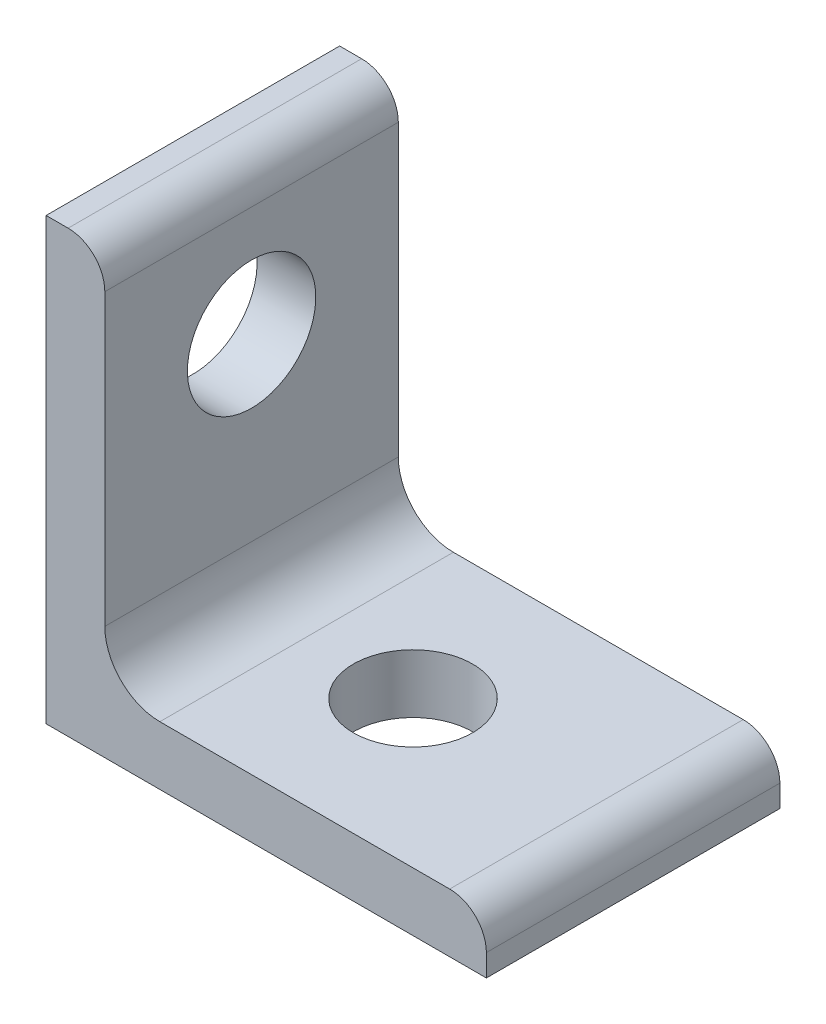
ISO-10303-21;
HEADER;
FILE_DESCRIPTION(('STEP AP214'),'2;1');
FILE_NAME('part.step','',(''),(''),'','','');
FILE_SCHEMA(('AUTOMOTIVE_DESIGN { 1 0 10303 214 1 1 1 1 }'));
ENDSEC;
DATA;
#1=APPLICATION_CONTEXT('core data for automotive mechanical design processes');
#2=APPLICATION_PROTOCOL_DEFINITION('international standard','automotive_design',2000,#1);
#3=PRODUCT_CONTEXT('',#1,'mechanical');
#4=PRODUCT('Part','Part','',(#3));
#5=PRODUCT_RELATED_PRODUCT_CATEGORY('part','',(#4));
#6=PRODUCT_DEFINITION_FORMATION('','',#4);
#7=PRODUCT_DEFINITION_CONTEXT('part definition',#1,'design');
#8=PRODUCT_DEFINITION('design','',#6,#7);
#9=PRODUCT_DEFINITION_SHAPE('','',#8);
#10=(LENGTH_UNIT() NAMED_UNIT(*) SI_UNIT(.MILLI.,.METRE.));
#11=(NAMED_UNIT(*) PLANE_ANGLE_UNIT() SI_UNIT($,.RADIAN.));
#12=(NAMED_UNIT(*) SI_UNIT($,.STERADIAN.) SOLID_ANGLE_UNIT());
#13=UNCERTAINTY_MEASURE_WITH_UNIT(LENGTH_MEASURE(1.E-05),#10,'distance_accuracy_value','');
#14=(GEOMETRIC_REPRESENTATION_CONTEXT(3) GLOBAL_UNCERTAINTY_ASSIGNED_CONTEXT((#13)) GLOBAL_UNIT_ASSIGNED_CONTEXT((#10,
#11,#12)) REPRESENTATION_CONTEXT('',''));
#15=CARTESIAN_POINT('',(0.,0.,0.));
#16=DIRECTION('',(0.,0.,1.));
#17=DIRECTION('',(1.,0.,0.));
#18=AXIS2_PLACEMENT_3D('',#15,#16,#17);
#19=CARTESIAN_POINT('',(0.,0.,25.4));
#20=DIRECTION('',(0.,1.,0.));
#21=DIRECTION('',(0.,0.,1.));
#22=AXIS2_PLACEMENT_3D('',#19,#20,#21);
#23=PLANE('',#22);
#24=CARTESIAN_POINT('',(19.05,0.,12.7));
#25=DIRECTION('',(0.,1.,0.));
#26=DIRECTION('',(0.,0.,1.));
#27=AXIS2_PLACEMENT_3D('',#24,#25,#26);
#28=CIRCLE('',#27,5.15874);
#29=CARTESIAN_POINT('',(19.05,0.,17.85874));
#30=VERTEX_POINT('',#29);
#31=EDGE_CURVE('E124',#30,#30,#28,.T.);
#32=ORIENTED_EDGE('',*,*,#31,.T.);
#33=EDGE_LOOP('',(#32));
#34=FACE_BOUND('',#33,.T.);
#35=DIRECTION('',(1.,0.,0.));
#36=VECTOR('',#35,1.);
#37=CARTESIAN_POINT('',(0.,0.,0.));
#38=LINE('',#37,#36);
#39=CARTESIAN_POINT('',(0.,0.,0.));
#40=VERTEX_POINT('',#39);
#41=CARTESIAN_POINT('',(38.1,0.,0.));
#42=VERTEX_POINT('',#41);
#43=EDGE_CURVE('E110',#40,#42,#38,.T.);
#44=ORIENTED_EDGE('',*,*,#43,.T.);
#45=DIRECTION('',(0.,0.,-1.));
#46=VECTOR('',#45,1.);
#47=CARTESIAN_POINT('',(38.1,0.,25.4));
#48=LINE('',#47,#46);
#49=CARTESIAN_POINT('',(38.1,0.,25.4));
#50=VERTEX_POINT('',#49);
#51=EDGE_CURVE('E11',#50,#42,#48,.T.);
#52=ORIENTED_EDGE('',*,*,#51,.F.);
#53=DIRECTION('',(1.,0.,0.));
#54=VECTOR('',#53,1.);
#55=CARTESIAN_POINT('',(0.,0.,25.4));
#56=LINE('',#55,#54);
#57=CARTESIAN_POINT('',(0.,0.,25.4));
#58=VERTEX_POINT('',#57);
#59=EDGE_CURVE('E144',#58,#50,#56,.T.);
#60=ORIENTED_EDGE('',*,*,#59,.F.);
#61=DIRECTION('',(0.,0.,-1.));
#62=VECTOR('',#61,1.);
#63=CARTESIAN_POINT('',(0.,0.,25.4));
#64=LINE('',#63,#62);
#65=EDGE_CURVE('E123',#58,#40,#64,.T.);
#66=ORIENTED_EDGE('',*,*,#65,.T.);
#67=EDGE_LOOP('',(#44,#52,#60,#66));
#68=FACE_BOUND('',#67,.T.);
#69=ADVANCED_FACE('F36',(#34,#68),#23,.F.);
#70=CARTESIAN_POINT('',(38.1,0.,25.4));
#71=DIRECTION('',(-1.,0.,0.));
#72=DIRECTION('',(0.,0.,1.));
#73=AXIS2_PLACEMENT_3D('',#70,#71,#72);
#74=PLANE('',#73);
#75=DIRECTION('',(0.,1.,0.));
#76=VECTOR('',#75,1.);
#77=CARTESIAN_POINT('',(38.1,0.,0.));
#78=LINE('',#77,#76);
#79=CARTESIAN_POINT('',(38.1,1.905,0.));
#80=VERTEX_POINT('',#79);
#81=EDGE_CURVE('E106',#42,#80,#78,.T.);
#82=ORIENTED_EDGE('',*,*,#81,.T.);
#83=DIRECTION('',(0.,0.,-1.));
#84=VECTOR('',#83,1.);
#85=CARTESIAN_POINT('',(38.1,1.905,25.4));
#86=LINE('',#85,#84);
#87=CARTESIAN_POINT('',(38.1,1.905,25.4));
#88=VERTEX_POINT('',#87);
#89=EDGE_CURVE('E43',#88,#80,#86,.T.);
#90=ORIENTED_EDGE('',*,*,#89,.F.);
#91=DIRECTION('',(0.,1.,0.));
#92=VECTOR('',#91,1.);
#93=CARTESIAN_POINT('',(38.1,0.,25.4));
#94=LINE('',#93,#92);
#95=EDGE_CURVE('E119',#50,#88,#94,.T.);
#96=ORIENTED_EDGE('',*,*,#95,.F.);
#97=ORIENTED_EDGE('',*,*,#51,.T.);
#98=EDGE_LOOP('',(#82,#90,#96,#97));
#99=FACE_BOUND('',#98,.T.);
#100=ADVANCED_FACE('F118',(#99),#74,.F.);
#101=CARTESIAN_POINT('',(34.925,1.905,25.4));
#102=DIRECTION('',(0.,0.,-1.));
#103=DIRECTION('',(-1.,0.,0.));
#104=AXIS2_PLACEMENT_3D('',#101,#102,#103);
#105=CYLINDRICAL_SURFACE('',#104,3.175);
#106=CARTESIAN_POINT('',(34.925,1.905,0.));
#107=DIRECTION('',(0.,0.,1.));
#108=DIRECTION('',(1.,0.,0.));
#109=AXIS2_PLACEMENT_3D('',#106,#107,#108);
#110=CIRCLE('',#109,3.175);
#111=CARTESIAN_POINT('',(34.925,5.08,0.));
#112=VERTEX_POINT('',#111);
#113=EDGE_CURVE('E112',#80,#112,#110,.T.);
#114=ORIENTED_EDGE('',*,*,#113,.T.);
#115=DIRECTION('',(0.,0.,-1.));
#116=VECTOR('',#115,1.);
#117=CARTESIAN_POINT('',(34.925,5.08,25.4));
#118=LINE('',#117,#116);
#119=CARTESIAN_POINT('',(34.925,5.08,25.4));
#120=VERTEX_POINT('',#119);
#121=EDGE_CURVE('E175',#120,#112,#118,.T.);
#122=ORIENTED_EDGE('',*,*,#121,.F.);
#123=CARTESIAN_POINT('',(34.925,1.905,25.4));
#124=DIRECTION('',(0.,0.,1.));
#125=DIRECTION('',(1.,0.,0.));
#126=AXIS2_PLACEMENT_3D('',#123,#124,#125);
#127=CIRCLE('',#126,3.175);
#128=EDGE_CURVE('E147',#88,#120,#127,.T.);
#129=ORIENTED_EDGE('',*,*,#128,.F.);
#130=ORIENTED_EDGE('',*,*,#89,.T.);
#131=EDGE_LOOP('',(#114,#122,#129,#130));
#132=FACE_BOUND('',#131,.T.);
#133=ADVANCED_FACE('F179',(#132),#105,.T.);
#134=CARTESIAN_POINT('',(34.925,5.08,25.4));
#135=DIRECTION('',(0.,-1.,0.));
#136=DIRECTION('',(1.,0.,0.));
#137=AXIS2_PLACEMENT_3D('',#134,#135,#136);
#138=PLANE('',#137);
#139=CARTESIAN_POINT('',(19.05,5.08,12.7));
#140=DIRECTION('',(0.,1.,0.));
#141=DIRECTION('',(0.,0.,1.));
#142=AXIS2_PLACEMENT_3D('',#139,#140,#141);
#143=CIRCLE('',#142,5.15874);
#144=CARTESIAN_POINT('',(19.05,5.08,17.85874));
#145=VERTEX_POINT('',#144);
#146=EDGE_CURVE('E127',#145,#145,#143,.T.);
#147=ORIENTED_EDGE('',*,*,#146,.F.);
#148=EDGE_LOOP('',(#147));
#149=FACE_BOUND('',#148,.T.);
#150=DIRECTION('',(-1.,0.,0.));
#151=VECTOR('',#150,1.);
#152=CARTESIAN_POINT('',(34.925,5.08,0.));
#153=LINE('',#152,#151);
#154=CARTESIAN_POINT('',(9.8425,5.07999999999999,0.));
#155=VERTEX_POINT('',#154);
#156=EDGE_CURVE('E132',#112,#155,#153,.T.);
#157=ORIENTED_EDGE('',*,*,#156,.T.);
#158=DIRECTION('',(0.,0.,-1.));
#159=VECTOR('',#158,1.);
#160=CARTESIAN_POINT('',(9.8425,5.07999999999999,25.4));
#161=LINE('',#160,#159);
#162=CARTESIAN_POINT('',(9.8425,5.07999999999999,25.4));
#163=VERTEX_POINT('',#162);
#164=EDGE_CURVE('E172',#163,#155,#161,.T.);
#165=ORIENTED_EDGE('',*,*,#164,.F.);
#166=DIRECTION('',(-1.,0.,0.));
#167=VECTOR('',#166,1.);
#168=CARTESIAN_POINT('',(34.925,5.08,25.4));
#169=LINE('',#168,#167);
#170=EDGE_CURVE('E149',#120,#163,#169,.T.);
#171=ORIENTED_EDGE('',*,*,#170,.F.);
#172=ORIENTED_EDGE('',*,*,#121,.T.);
#173=EDGE_LOOP('',(#157,#165,#171,#172));
#174=FACE_BOUND('',#173,.T.);
#175=ADVANCED_FACE('F187',(#149,#174),#138,.F.);
#176=CARTESIAN_POINT('',(9.8425,9.84249999999999,25.4));
#177=DIRECTION('',(0.,0.,-1.));
#178=DIRECTION('',(-1.,0.,0.));
#179=AXIS2_PLACEMENT_3D('',#176,#177,#178);
#180=CYLINDRICAL_SURFACE('',#179,4.7625);
#181=CARTESIAN_POINT('',(9.8425,9.84249999999999,0.));
#182=DIRECTION('',(0.,0.,-1.));
#183=DIRECTION('',(1.,0.,0.));
#184=AXIS2_PLACEMENT_3D('',#181,#182,#183);
#185=CIRCLE('',#184,4.7625);
#186=CARTESIAN_POINT('',(5.08,9.84249999999999,0.));
#187=VERTEX_POINT('',#186);
#188=EDGE_CURVE('E134',#155,#187,#185,.T.);
#189=ORIENTED_EDGE('',*,*,#188,.T.);
#190=DIRECTION('',(0.,0.,-1.));
#191=VECTOR('',#190,1.);
#192=CARTESIAN_POINT('',(5.08,9.84249999999999,25.4));
#193=LINE('',#192,#191);
#194=CARTESIAN_POINT('',(5.08,9.84249999999999,25.4));
#195=VERTEX_POINT('',#194);
#196=EDGE_CURVE('E169',#195,#187,#193,.T.);
#197=ORIENTED_EDGE('',*,*,#196,.F.);
#198=CARTESIAN_POINT('',(9.8425,9.84249999999999,25.4));
#199=DIRECTION('',(0.,0.,-1.));
#200=DIRECTION('',(1.,0.,0.));
#201=AXIS2_PLACEMENT_3D('',#198,#199,#200);
#202=CIRCLE('',#201,4.7625);
#203=EDGE_CURVE('E151',#163,#195,#202,.T.);
#204=ORIENTED_EDGE('',*,*,#203,.F.);
#205=ORIENTED_EDGE('',*,*,#164,.T.);
#206=EDGE_LOOP('',(#189,#197,#204,#205));
#207=FACE_BOUND('',#206,.T.);
#208=ADVANCED_FACE('F190',(#207),#180,.F.);
#209=CARTESIAN_POINT('',(5.08,34.925,25.4));
#210=DIRECTION('',(-1.,0.,0.));
#211=DIRECTION('',(0.,-1.,0.));
#212=AXIS2_PLACEMENT_3D('',#209,#210,#211);
#213=PLANE('',#212);
#214=CARTESIAN_POINT('',(5.08,25.4,12.7));
#215=DIRECTION('',(1.,0.,0.));
#216=DIRECTION('',(0.,1.,0.));
#217=AXIS2_PLACEMENT_3D('',#214,#215,#216);
#218=CIRCLE('',#217,5.55625);
#219=CARTESIAN_POINT('',(5.08,30.95625,12.7));
#220=VERTEX_POINT('',#219);
#221=EDGE_CURVE('E233',#220,#220,#218,.T.);
#222=ORIENTED_EDGE('',*,*,#221,.F.);
#223=EDGE_LOOP('',(#222));
#224=FACE_BOUND('',#223,.T.);
#225=DIRECTION('',(0.,1.,0.));
#226=VECTOR('',#225,1.);
#227=CARTESIAN_POINT('',(5.08,34.925,0.));
#228=LINE('',#227,#226);
#229=CARTESIAN_POINT('',(5.07999999999999,34.925,0.));
#230=VERTEX_POINT('',#229);
#231=EDGE_CURVE('E136',#187,#230,#228,.T.);
#232=ORIENTED_EDGE('',*,*,#231,.T.);
#233=DIRECTION('',(0.,0.,-1.));
#234=VECTOR('',#233,1.);
#235=CARTESIAN_POINT('',(5.07999999999999,34.925,25.4));
#236=LINE('',#235,#234);
#237=CARTESIAN_POINT('',(5.07999999999999,34.925,25.4));
#238=VERTEX_POINT('',#237);
#239=EDGE_CURVE('E166',#238,#230,#236,.T.);
#240=ORIENTED_EDGE('',*,*,#239,.F.);
#241=DIRECTION('',(0.,1.,0.));
#242=VECTOR('',#241,1.);
#243=CARTESIAN_POINT('',(5.08,34.925,25.4));
#244=LINE('',#243,#242);
#245=EDGE_CURVE('E153',#195,#238,#244,.T.);
#246=ORIENTED_EDGE('',*,*,#245,.F.);
#247=ORIENTED_EDGE('',*,*,#196,.T.);
#248=EDGE_LOOP('',(#232,#240,#246,#247));
#249=FACE_BOUND('',#248,.T.);
#250=ADVANCED_FACE('F195',(#224,#249),#213,.F.);
#251=CARTESIAN_POINT('',(1.905,34.925,25.4));
#252=DIRECTION('',(0.,0.,-1.));
#253=DIRECTION('',(-1.,0.,0.));
#254=AXIS2_PLACEMENT_3D('',#251,#252,#253);
#255=CYLINDRICAL_SURFACE('',#254,3.17499999999999);
#256=CARTESIAN_POINT('',(1.905,34.925,0.));
#257=DIRECTION('',(0.,0.,1.));
#258=DIRECTION('',(1.,0.,0.));
#259=AXIS2_PLACEMENT_3D('',#256,#257,#258);
#260=CIRCLE('',#259,3.17499999999999);
#261=CARTESIAN_POINT('',(1.905,38.1,0.));
#262=VERTEX_POINT('',#261);
#263=EDGE_CURVE('E138',#230,#262,#260,.T.);
#264=ORIENTED_EDGE('',*,*,#263,.T.);
#265=DIRECTION('',(0.,0.,-1.));
#266=VECTOR('',#265,1.);
#267=CARTESIAN_POINT('',(1.905,38.1,25.4));
#268=LINE('',#267,#266);
#269=CARTESIAN_POINT('',(1.905,38.1,25.4));
#270=VERTEX_POINT('',#269);
#271=EDGE_CURVE('E163',#270,#262,#268,.T.);
#272=ORIENTED_EDGE('',*,*,#271,.F.);
#273=CARTESIAN_POINT('',(1.905,34.925,25.4));
#274=DIRECTION('',(0.,0.,1.));
#275=DIRECTION('',(1.,0.,0.));
#276=AXIS2_PLACEMENT_3D('',#273,#274,#275);
#277=CIRCLE('',#276,3.17499999999999);
#278=EDGE_CURVE('E155',#238,#270,#277,.T.);
#279=ORIENTED_EDGE('',*,*,#278,.F.);
#280=ORIENTED_EDGE('',*,*,#239,.T.);
#281=EDGE_LOOP('',(#264,#272,#279,#280));
#282=FACE_BOUND('',#281,.T.);
#283=ADVANCED_FACE('F199',(#282),#255,.T.);
#284=CARTESIAN_POINT('',(0.,38.1,25.4));
#285=DIRECTION('',(0.,-1.,0.));
#286=DIRECTION('',(1.,0.,0.));
#287=AXIS2_PLACEMENT_3D('',#284,#285,#286);
#288=PLANE('',#287);
#289=DIRECTION('',(-1.,0.,0.));
#290=VECTOR('',#289,1.);
#291=CARTESIAN_POINT('',(0.,38.1,0.));
#292=LINE('',#291,#290);
#293=CARTESIAN_POINT('',(0.,38.1,0.));
#294=VERTEX_POINT('',#293);
#295=EDGE_CURVE('E140',#262,#294,#292,.T.);
#296=ORIENTED_EDGE('',*,*,#295,.T.);
#297=DIRECTION('',(0.,0.,-1.));
#298=VECTOR('',#297,1.);
#299=CARTESIAN_POINT('',(0.,38.1,25.4));
#300=LINE('',#299,#298);
#301=CARTESIAN_POINT('',(0.,38.1,25.4));
#302=VERTEX_POINT('',#301);
#303=EDGE_CURVE('E160',#302,#294,#300,.T.);
#304=ORIENTED_EDGE('',*,*,#303,.F.);
#305=DIRECTION('',(-1.,0.,0.));
#306=VECTOR('',#305,1.);
#307=CARTESIAN_POINT('',(0.,38.1,25.4));
#308=LINE('',#307,#306);
#309=EDGE_CURVE('E55',#270,#302,#308,.T.);
#310=ORIENTED_EDGE('',*,*,#309,.F.);
#311=ORIENTED_EDGE('',*,*,#271,.T.);
#312=EDGE_LOOP('',(#296,#304,#310,#311));
#313=FACE_BOUND('',#312,.T.);
#314=ADVANCED_FACE('F203',(#313),#288,.F.);
#315=CARTESIAN_POINT('',(0.,0.,25.4));
#316=DIRECTION('',(1.,0.,0.));
#317=DIRECTION('',(0.,1.,0.));
#318=AXIS2_PLACEMENT_3D('',#315,#316,#317);
#319=PLANE('',#318);
#320=CARTESIAN_POINT('',(0.,25.4,12.7));
#321=DIRECTION('',(1.,0.,0.));
#322=DIRECTION('',(0.,1.,0.));
#323=AXIS2_PLACEMENT_3D('',#320,#321,#322);
#324=CIRCLE('',#323,5.55625);
#325=CARTESIAN_POINT('',(0.,30.95625,12.7));
#326=VERTEX_POINT('',#325);
#327=EDGE_CURVE('E231',#326,#326,#324,.F.);
#328=ORIENTED_EDGE('',*,*,#327,.F.);
#329=EDGE_LOOP('',(#328));
#330=FACE_BOUND('',#329,.T.);
#331=DIRECTION('',(0.,-1.,0.));
#332=VECTOR('',#331,1.);
#333=CARTESIAN_POINT('',(0.,0.,0.));
#334=LINE('',#333,#332);
#335=EDGE_CURVE('E142',#294,#40,#334,.T.);
#336=ORIENTED_EDGE('',*,*,#335,.T.);
#337=ORIENTED_EDGE('',*,*,#65,.F.);
#338=DIRECTION('',(0.,-1.,0.));
#339=VECTOR('',#338,1.);
#340=CARTESIAN_POINT('',(0.,0.,25.4));
#341=LINE('',#340,#339);
#342=EDGE_CURVE('E50',#302,#58,#341,.T.);
#343=ORIENTED_EDGE('',*,*,#342,.F.);
#344=ORIENTED_EDGE('',*,*,#303,.T.);
#345=EDGE_LOOP('',(#336,#337,#343,#344));
#346=FACE_BOUND('',#345,.T.);
#347=ADVANCED_FACE('F205',(#330,#346),#319,.F.);
#348=CARTESIAN_POINT('',(34.925,1.905,25.4));
#349=DIRECTION('',(0.,0.,1.));
#350=DIRECTION('',(1.,0.,0.));
#351=AXIS2_PLACEMENT_3D('',#348,#349,#350);
#352=PLANE('',#351);
#353=ORIENTED_EDGE('',*,*,#59,.T.);
#354=ORIENTED_EDGE('',*,*,#95,.T.);
#355=ORIENTED_EDGE('',*,*,#128,.T.);
#356=ORIENTED_EDGE('',*,*,#170,.T.);
#357=ORIENTED_EDGE('',*,*,#203,.T.);
#358=ORIENTED_EDGE('',*,*,#245,.T.);
#359=ORIENTED_EDGE('',*,*,#278,.T.);
#360=ORIENTED_EDGE('',*,*,#309,.T.);
#361=ORIENTED_EDGE('',*,*,#342,.T.);
#362=EDGE_LOOP('',(#353,#354,#355,#356,#357,#358,#359,#360,#361));
#363=FACE_BOUND('',#362,.T.);
#364=ADVANCED_FACE('F182',(#363),#352,.T.);
#365=CARTESIAN_POINT('',(34.925,1.905,0.));
#366=DIRECTION('',(0.,0.,1.));
#367=DIRECTION('',(1.,0.,0.));
#368=AXIS2_PLACEMENT_3D('',#365,#366,#367);
#369=PLANE('',#368);
#370=ORIENTED_EDGE('',*,*,#43,.F.);
#371=ORIENTED_EDGE('',*,*,#335,.F.);
#372=ORIENTED_EDGE('',*,*,#295,.F.);
#373=ORIENTED_EDGE('',*,*,#263,.F.);
#374=ORIENTED_EDGE('',*,*,#231,.F.);
#375=ORIENTED_EDGE('',*,*,#188,.F.);
#376=ORIENTED_EDGE('',*,*,#156,.F.);
#377=ORIENTED_EDGE('',*,*,#113,.F.);
#378=ORIENTED_EDGE('',*,*,#81,.F.);
#379=EDGE_LOOP('',(#370,#371,#372,#373,#374,#375,#376,#377,#378));
#380=FACE_BOUND('',#379,.T.);
#381=ADVANCED_FACE('F107',(#380),#369,.F.);
#382=CARTESIAN_POINT('',(19.05,5.08,12.7));
#383=DIRECTION('',(0.,1.,0.));
#384=DIRECTION('',(0.,0.,1.));
#385=AXIS2_PLACEMENT_3D('',#382,#383,#384);
#386=CYLINDRICAL_SURFACE('',#385,5.15874);
#387=ORIENTED_EDGE('',*,*,#31,.F.);
#388=EDGE_LOOP('',(#387));
#389=FACE_BOUND('',#388,.T.);
#390=ORIENTED_EDGE('',*,*,#146,.T.);
#391=EDGE_LOOP('',(#390));
#392=FACE_BOUND('',#391,.T.);
#393=ADVANCED_FACE('F223',(#389,#392),#386,.F.);
#394=CARTESIAN_POINT('',(-0.00100000000001575,25.4,12.7));
#395=DIRECTION('',(1.,0.,0.));
#396=DIRECTION('',(0.,1.,0.));
#397=AXIS2_PLACEMENT_3D('',#394,#395,#396);
#398=CYLINDRICAL_SURFACE('',#397,5.55625);
#399=ORIENTED_EDGE('',*,*,#221,.T.);
#400=EDGE_LOOP('',(#399));
#401=FACE_BOUND('',#400,.T.);
#402=ORIENTED_EDGE('',*,*,#327,.T.);
#403=EDGE_LOOP('',(#402));
#404=FACE_BOUND('',#403,.T.);
#405=ADVANCED_FACE('F226',(#401,#404),#398,.F.);
#406=CLOSED_SHELL('',(#69,#100,#133,#175,#208,#250,#283,#314,#347,#364,#381,#393,#405));
#407=MANIFOLD_SOLID_BREP('B2',#406);
#408=ADVANCED_BREP_SHAPE_REPRESENTATION('',(#18,#407),#14);
#409=SHAPE_DEFINITION_REPRESENTATION(#9,#408);
ENDSEC;
END-ISO-10303-21;
